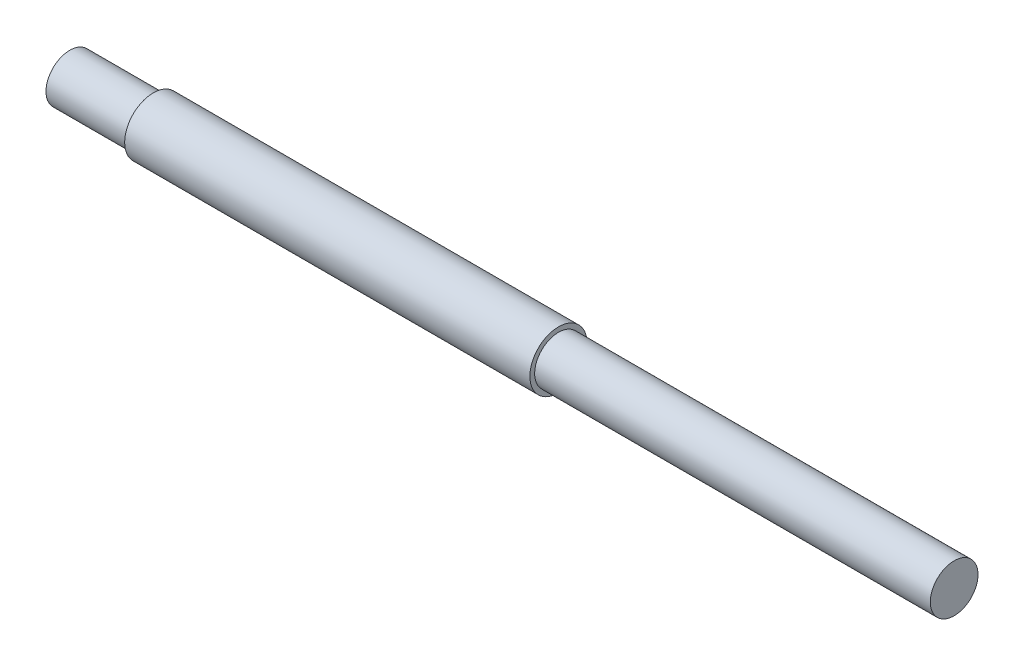
ISO-10303-21;
HEADER;
FILE_DESCRIPTION(('STEP AP214'),'2;1');
FILE_NAME('part.step','',(''),(''),'','','');
FILE_SCHEMA(('AUTOMOTIVE_DESIGN { 1 0 10303 214 1 1 1 1 }'));
ENDSEC;
DATA;
#1=APPLICATION_CONTEXT('core data for automotive mechanical design processes');
#2=APPLICATION_PROTOCOL_DEFINITION('international standard','automotive_design',2000,#1);
#3=PRODUCT_CONTEXT('',#1,'mechanical');
#4=PRODUCT('Part','Part','',(#3));
#5=PRODUCT_RELATED_PRODUCT_CATEGORY('part','',(#4));
#6=PRODUCT_DEFINITION_FORMATION('','',#4);
#7=PRODUCT_DEFINITION_CONTEXT('part definition',#1,'design');
#8=PRODUCT_DEFINITION('design','',#6,#7);
#9=PRODUCT_DEFINITION_SHAPE('','',#8);
#10=(LENGTH_UNIT() NAMED_UNIT(*) SI_UNIT(.MILLI.,.METRE.));
#11=(NAMED_UNIT(*) PLANE_ANGLE_UNIT() SI_UNIT($,.RADIAN.));
#12=(NAMED_UNIT(*) SI_UNIT($,.STERADIAN.) SOLID_ANGLE_UNIT());
#13=UNCERTAINTY_MEASURE_WITH_UNIT(LENGTH_MEASURE(1.E-05),#10,'distance_accuracy_value','');
#14=(GEOMETRIC_REPRESENTATION_CONTEXT(3) GLOBAL_UNCERTAINTY_ASSIGNED_CONTEXT((#13)) GLOBAL_UNIT_ASSIGNED_CONTEXT((#10,
#11,#12)) REPRESENTATION_CONTEXT('',''));
#15=CARTESIAN_POINT('',(0.,0.,0.));
#16=DIRECTION('',(0.,0.,1.));
#17=DIRECTION('',(1.,0.,0.));
#18=AXIS2_PLACEMENT_3D('',#15,#16,#17);
#19=CARTESIAN_POINT('',(0.,0.,-6.));
#20=DIRECTION('',(-1.,0.,0.));
#21=DIRECTION('',(0.,0.,1.));
#22=AXIS2_PLACEMENT_3D('',#19,#20,#21);
#23=CYLINDRICAL_SURFACE('',#22,6.);
#24=CARTESIAN_POINT('',(102.5,0.,-6.));
#25=DIRECTION('',(1.,0.,0.));
#26=DIRECTION('',(0.,0.,-1.));
#27=AXIS2_PLACEMENT_3D('',#24,#25,#26);
#28=CIRCLE('',#27,6.);
#29=CARTESIAN_POINT('',(102.5,0.,-12.));
#30=VERTEX_POINT('',#29);
#31=EDGE_CURVE('E10',#30,#30,#28,.T.);
#32=ORIENTED_EDGE('',*,*,#31,.F.);
#33=EDGE_LOOP('',(#32));
#34=FACE_BOUND('',#33,.T.);
#35=CARTESIAN_POINT('',(17.5,0.,-6.));
#36=DIRECTION('',(-1.,0.,0.));
#37=DIRECTION('',(0.,0.,1.));
#38=AXIS2_PLACEMENT_3D('',#35,#36,#37);
#39=CIRCLE('',#38,6.);
#40=CARTESIAN_POINT('',(17.5,0.,0.));
#41=VERTEX_POINT('',#40);
#42=EDGE_CURVE('E66',#41,#41,#39,.T.);
#43=ORIENTED_EDGE('',*,*,#42,.F.);
#44=EDGE_LOOP('',(#43));
#45=FACE_BOUND('',#44,.T.);
#46=ADVANCED_FACE('F41',(#34,#45),#23,.T.);
#47=CARTESIAN_POINT('',(102.5,0.,-6.));
#48=DIRECTION('',(1.,0.,0.));
#49=DIRECTION('',(0.,0.,-1.));
#50=AXIS2_PLACEMENT_3D('',#47,#48,#49);
#51=PLANE('',#50);
#52=CARTESIAN_POINT('',(102.5,0.,-6.));
#53=DIRECTION('',(1.,0.,0.));
#54=DIRECTION('',(0.,0.,-1.));
#55=AXIS2_PLACEMENT_3D('',#52,#53,#54);
#56=CIRCLE('',#55,5.);
#57=CARTESIAN_POINT('',(102.5,0.,-11.));
#58=VERTEX_POINT('',#57);
#59=EDGE_CURVE('E49',#58,#58,#56,.T.);
#60=ORIENTED_EDGE('',*,*,#59,.F.);
#61=EDGE_LOOP('',(#60));
#62=FACE_BOUND('',#61,.T.);
#63=ORIENTED_EDGE('',*,*,#31,.T.);
#64=EDGE_LOOP('',(#63));
#65=FACE_BOUND('',#64,.T.);
#66=ADVANCED_FACE('F78',(#62,#65),#51,.T.);
#67=CARTESIAN_POINT('',(102.5,0.,-6.));
#68=DIRECTION('',(1.,0.,0.));
#69=DIRECTION('',(0.,0.,-1.));
#70=AXIS2_PLACEMENT_3D('',#67,#68,#69);
#71=CYLINDRICAL_SURFACE('',#70,5.);
#72=ORIENTED_EDGE('',*,*,#59,.T.);
#73=EDGE_LOOP('',(#72));
#74=FACE_BOUND('',#73,.T.);
#75=CARTESIAN_POINT('',(185.5,0.,-6.));
#76=DIRECTION('',(1.,0.,0.));
#77=DIRECTION('',(0.,0.,-1.));
#78=AXIS2_PLACEMENT_3D('',#75,#76,#77);
#79=CIRCLE('',#78,5.);
#80=CARTESIAN_POINT('',(185.5,0.,-11.));
#81=VERTEX_POINT('',#80);
#82=EDGE_CURVE('E54',#81,#81,#79,.T.);
#83=ORIENTED_EDGE('',*,*,#82,.F.);
#84=EDGE_LOOP('',(#83));
#85=FACE_BOUND('',#84,.T.);
#86=ADVANCED_FACE('F84',(#74,#85),#71,.T.);
#87=CARTESIAN_POINT('',(185.5,0.,-6.));
#88=DIRECTION('',(1.,0.,0.));
#89=DIRECTION('',(0.,0.,-1.));
#90=AXIS2_PLACEMENT_3D('',#87,#88,#89);
#91=PLANE('',#90);
#92=ORIENTED_EDGE('',*,*,#82,.T.);
#93=EDGE_LOOP('',(#92));
#94=FACE_BOUND('',#93,.T.);
#95=ADVANCED_FACE('F88',(#94),#91,.T.);
#96=CARTESIAN_POINT('',(17.5,0.,-6.));
#97=DIRECTION('',(-1.,0.,0.));
#98=DIRECTION('',(0.,0.,1.));
#99=AXIS2_PLACEMENT_3D('',#96,#97,#98);
#100=CYLINDRICAL_SURFACE('',#99,5.);
#101=CARTESIAN_POINT('',(17.5,0.,-6.));
#102=DIRECTION('',(-1.,0.,0.));
#103=DIRECTION('',(0.,0.,1.));
#104=AXIS2_PLACEMENT_3D('',#101,#102,#103);
#105=CIRCLE('',#104,5.);
#106=CARTESIAN_POINT('',(17.5,0.,-0.999999999999998));
#107=VERTEX_POINT('',#106);
#108=EDGE_CURVE('E60',#107,#107,#105,.T.);
#109=ORIENTED_EDGE('',*,*,#108,.T.);
#110=EDGE_LOOP('',(#109));
#111=FACE_BOUND('',#110,.T.);
#112=CARTESIAN_POINT('',(0.,0.,-6.));
#113=DIRECTION('',(-1.,0.,0.));
#114=DIRECTION('',(0.,0.,1.));
#115=AXIS2_PLACEMENT_3D('',#112,#113,#114);
#116=CIRCLE('',#115,5.);
#117=CARTESIAN_POINT('',(0.,0.,-0.999999999999998));
#118=VERTEX_POINT('',#117);
#119=EDGE_CURVE('E62',#118,#118,#116,.T.);
#120=ORIENTED_EDGE('',*,*,#119,.F.);
#121=EDGE_LOOP('',(#120));
#122=FACE_BOUND('',#121,.T.);
#123=ADVANCED_FACE('F90',(#111,#122),#100,.T.);
#124=CARTESIAN_POINT('',(17.5,0.,0.));
#125=DIRECTION('',(-1.,0.,0.));
#126=DIRECTION('',(0.,0.,1.));
#127=AXIS2_PLACEMENT_3D('',#124,#125,#126);
#128=PLANE('',#127);
#129=ORIENTED_EDGE('',*,*,#42,.T.);
#130=EDGE_LOOP('',(#129));
#131=FACE_BOUND('',#130,.T.);
#132=ORIENTED_EDGE('',*,*,#108,.F.);
#133=EDGE_LOOP('',(#132));
#134=FACE_BOUND('',#133,.T.);
#135=ADVANCED_FACE('F74',(#131,#134),#128,.T.);
#136=CARTESIAN_POINT('',(0.,0.,0.));
#137=DIRECTION('',(-1.,0.,0.));
#138=DIRECTION('',(0.,0.,1.));
#139=AXIS2_PLACEMENT_3D('',#136,#137,#138);
#140=PLANE('',#139);
#141=ORIENTED_EDGE('',*,*,#119,.T.);
#142=EDGE_LOOP('',(#141));
#143=FACE_BOUND('',#142,.T.);
#144=ADVANCED_FACE('F43',(#143),#140,.T.);
#145=CLOSED_SHELL('',(#46,#66,#86,#95,#123,#135,#144));
#146=MANIFOLD_SOLID_BREP('B2',#145);
#147=ADVANCED_BREP_SHAPE_REPRESENTATION('',(#18,#146),#14);
#148=SHAPE_DEFINITION_REPRESENTATION(#9,#147);
ENDSEC;
END-ISO-10303-21;
